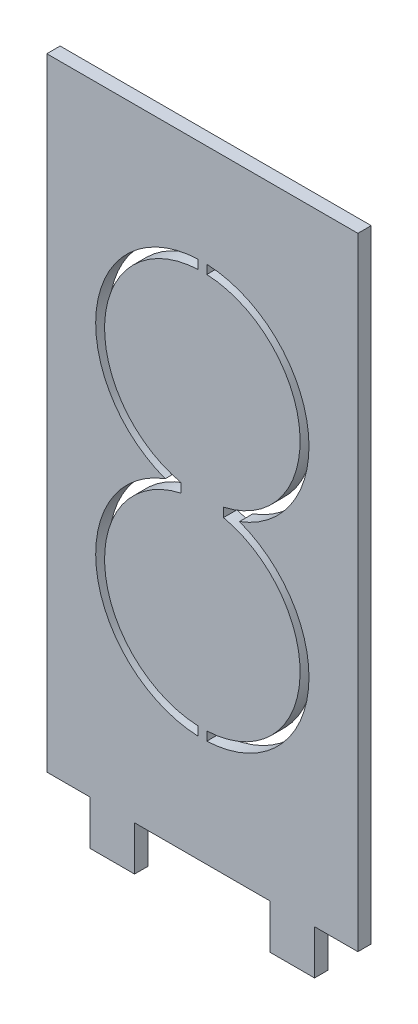
ISO-10303-21;
HEADER;
FILE_DESCRIPTION(('STEP AP214'),'2;1');
FILE_NAME('part.step','',(''),(''),'','','');
FILE_SCHEMA(('AUTOMOTIVE_DESIGN { 1 0 10303 214 1 1 1 1 }'));
ENDSEC;
DATA;
#1=APPLICATION_CONTEXT('core data for automotive mechanical design processes');
#2=APPLICATION_PROTOCOL_DEFINITION('international standard','automotive_design',2000,#1);
#3=PRODUCT_CONTEXT('',#1,'mechanical');
#4=PRODUCT('Part','Part','',(#3));
#5=PRODUCT_RELATED_PRODUCT_CATEGORY('part','',(#4));
#6=PRODUCT_DEFINITION_FORMATION('','',#4);
#7=PRODUCT_DEFINITION_CONTEXT('part definition',#1,'design');
#8=PRODUCT_DEFINITION('design','',#6,#7);
#9=PRODUCT_DEFINITION_SHAPE('','',#8);
#10=(LENGTH_UNIT() NAMED_UNIT(*) SI_UNIT(.MILLI.,.METRE.));
#11=(NAMED_UNIT(*) PLANE_ANGLE_UNIT() SI_UNIT($,.RADIAN.));
#12=(NAMED_UNIT(*) SI_UNIT($,.STERADIAN.) SOLID_ANGLE_UNIT());
#13=UNCERTAINTY_MEASURE_WITH_UNIT(LENGTH_MEASURE(1.E-05),#10,'distance_accuracy_value','');
#14=(GEOMETRIC_REPRESENTATION_CONTEXT(3) GLOBAL_UNCERTAINTY_ASSIGNED_CONTEXT((#13)) GLOBAL_UNIT_ASSIGNED_CONTEXT((#10,
#11,#12)) REPRESENTATION_CONTEXT('',''));
#15=CARTESIAN_POINT('',(0.,0.,0.));
#16=DIRECTION('',(0.,0.,1.));
#17=DIRECTION('',(1.,0.,0.));
#18=AXIS2_PLACEMENT_3D('',#15,#16,#17);
#19=CARTESIAN_POINT('',(18.,68.1857282912457,0.));
#20=DIRECTION('',(1.,0.,0.));
#21=DIRECTION('',(0.,1.,0.));
#22=AXIS2_PLACEMENT_3D('',#19,#20,#21);
#23=PLANE('',#22);
#24=DIRECTION('',(0.,1.,0.));
#25=VECTOR('',#24,1.);
#26=CARTESIAN_POINT('',(18.,68.1857282912457,1.5));
#27=LINE('',#26,#25);
#28=CARTESIAN_POINT('',(18.,17.0113708575995,1.5));
#29=VERTEX_POINT('',#28);
#30=CARTESIAN_POINT('',(18.,18.011369512082,1.5));
#31=VERTEX_POINT('',#30);
#32=EDGE_CURVE('E257',#29,#31,#27,.T.);
#33=ORIENTED_EDGE('',*,*,#32,.F.);
#34=DIRECTION('',(0.,0.,1.));
#35=VECTOR('',#34,1.);
#36=CARTESIAN_POINT('',(18.,17.0113708575995,0.));
#37=LINE('',#36,#35);
#38=CARTESIAN_POINT('',(18.,17.0113708575995,0.));
#39=VERTEX_POINT('',#38);
#40=EDGE_CURVE('E214',#29,#39,#37,.F.);
#41=ORIENTED_EDGE('',*,*,#40,.T.);
#42=DIRECTION('',(0.,1.,0.));
#43=VECTOR('',#42,1.);
#44=CARTESIAN_POINT('',(18.,68.1857282912457,0.));
#45=LINE('',#44,#43);
#46=CARTESIAN_POINT('',(18.,18.011369512082,0.));
#47=VERTEX_POINT('',#46);
#48=EDGE_CURVE('E253',#39,#47,#45,.T.);
#49=ORIENTED_EDGE('',*,*,#48,.T.);
#50=DIRECTION('',(0.,0.,1.));
#51=VECTOR('',#50,1.);
#52=CARTESIAN_POINT('',(18.,18.011369512082,0.));
#53=LINE('',#52,#51);
#54=EDGE_CURVE('E255',#47,#31,#53,.T.);
#55=ORIENTED_EDGE('',*,*,#54,.T.);
#56=EDGE_LOOP('',(#33,#41,#49,#55));
#57=FACE_BOUND('',#56,.T.);
#58=ADVANCED_FACE('F35',(#57),#23,.T.);
#59=CARTESIAN_POINT('',(17.,68.1857282912457,0.));
#60=DIRECTION('',(-1.,0.,0.));
#61=DIRECTION('',(0.,-1.,0.));
#62=AXIS2_PLACEMENT_3D('',#59,#60,#61);
#63=PLANE('',#62);
#64=DIRECTION('',(0.,-1.,0.));
#65=VECTOR('',#64,1.);
#66=CARTESIAN_POINT('',(17.,68.1857282912457,0.));
#67=LINE('',#66,#65);
#68=CARTESIAN_POINT('',(17.,18.011369512082,0.));
#69=VERTEX_POINT('',#68);
#70=CARTESIAN_POINT('',(17.,17.0113708575995,0.));
#71=VERTEX_POINT('',#70);
#72=EDGE_CURVE('E252',#69,#71,#67,.T.);
#73=ORIENTED_EDGE('',*,*,#72,.T.);
#74=DIRECTION('',(0.,0.,1.));
#75=VECTOR('',#74,1.);
#76=CARTESIAN_POINT('',(17.,17.0113708575995,0.));
#77=LINE('',#76,#75);
#78=CARTESIAN_POINT('',(17.,17.0113708575995,1.5));
#79=VERTEX_POINT('',#78);
#80=EDGE_CURVE('E11',#71,#79,#77,.T.);
#81=ORIENTED_EDGE('',*,*,#80,.T.);
#82=DIRECTION('',(0.,-1.,0.));
#83=VECTOR('',#82,1.);
#84=CARTESIAN_POINT('',(17.,68.1857282912457,1.5));
#85=LINE('',#84,#83);
#86=CARTESIAN_POINT('',(17.,18.0113695120821,1.5));
#87=VERTEX_POINT('',#86);
#88=EDGE_CURVE('E248',#87,#79,#85,.T.);
#89=ORIENTED_EDGE('',*,*,#88,.F.);
#90=DIRECTION('',(0.,0.,1.));
#91=VECTOR('',#90,1.);
#92=CARTESIAN_POINT('',(17.,18.011369512082,0.));
#93=LINE('',#92,#91);
#94=EDGE_CURVE('E263',#87,#69,#93,.F.);
#95=ORIENTED_EDGE('',*,*,#94,.T.);
#96=EDGE_LOOP('',(#73,#81,#89,#95));
#97=FACE_BOUND('',#96,.T.);
#98=ADVANCED_FACE('F463',(#97),#63,.T.);
#99=CARTESIAN_POINT('',(17.,63.4895789873627,1.5));
#100=VERTEX_POINT('',#99);
#101=CARTESIAN_POINT('',(17.,62.488630487918,1.5));
#102=VERTEX_POINT('',#101);
#103=EDGE_CURVE('E57',#100,#102,#85,.T.);
#104=ORIENTED_EDGE('',*,*,#103,.F.);
#105=DIRECTION('',(0.,0.,1.));
#106=VECTOR('',#105,1.);
#107=CARTESIAN_POINT('',(17.,63.4895789873627,0.));
#108=LINE('',#107,#106);
#109=CARTESIAN_POINT('',(17.,63.4895789873627,0.));
#110=VERTEX_POINT('',#109);
#111=EDGE_CURVE('E227',#100,#110,#108,.F.);
#112=ORIENTED_EDGE('',*,*,#111,.T.);
#113=CARTESIAN_POINT('',(17.,62.488630487918,0.));
#114=VERTEX_POINT('',#113);
#115=EDGE_CURVE('E249',#110,#114,#67,.T.);
#116=ORIENTED_EDGE('',*,*,#115,.T.);
#117=DIRECTION('',(0.,0.,1.));
#118=VECTOR('',#117,1.);
#119=CARTESIAN_POINT('',(17.,62.488630487918,0.));
#120=LINE('',#119,#118);
#121=EDGE_CURVE('E265',#114,#102,#120,.T.);
#122=ORIENTED_EDGE('',*,*,#121,.T.);
#123=EDGE_LOOP('',(#104,#112,#116,#122));
#124=FACE_BOUND('',#123,.T.);
#125=ADVANCED_FACE('F469',(#124),#63,.T.);
#126=CARTESIAN_POINT('',(18.,62.488630487918,0.));
#127=VERTEX_POINT('',#126);
#128=CARTESIAN_POINT('',(18.,63.4895789873627,0.));
#129=VERTEX_POINT('',#128);
#130=EDGE_CURVE('E251',#127,#129,#45,.T.);
#131=ORIENTED_EDGE('',*,*,#130,.T.);
#132=DIRECTION('',(0.,0.,1.));
#133=VECTOR('',#132,1.);
#134=CARTESIAN_POINT('',(18.,63.4895789873627,0.));
#135=LINE('',#134,#133);
#136=CARTESIAN_POINT('',(18.,63.4895789873627,1.5));
#137=VERTEX_POINT('',#136);
#138=EDGE_CURVE('E43',#129,#137,#135,.T.);
#139=ORIENTED_EDGE('',*,*,#138,.T.);
#140=CARTESIAN_POINT('',(18.,62.488630487918,1.5));
#141=VERTEX_POINT('',#140);
#142=EDGE_CURVE('E233',#141,#137,#27,.T.);
#143=ORIENTED_EDGE('',*,*,#142,.F.);
#144=DIRECTION('',(0.,0.,1.));
#145=VECTOR('',#144,1.);
#146=CARTESIAN_POINT('',(18.,62.488630487918,0.));
#147=LINE('',#146,#145);
#148=EDGE_CURVE('E261',#141,#127,#147,.F.);
#149=ORIENTED_EDGE('',*,*,#148,.T.);
#150=EDGE_LOOP('',(#131,#139,#143,#149));
#151=FACE_BOUND('',#150,.T.);
#152=ADVANCED_FACE('F305',(#151),#23,.T.);
#153=CARTESIAN_POINT('',(17.5,51.5,0.));
#154=DIRECTION('',(0.,0.,1.));
#155=DIRECTION('',(1.,0.,0.));
#156=AXIS2_PLACEMENT_3D('',#153,#154,#155);
#157=CYLINDRICAL_SURFACE('',#156,11.);
#158=ORIENTED_EDGE('',*,*,#121,.F.);
#159=CARTESIAN_POINT('',(17.5,51.5,0.));
#160=DIRECTION('',(0.,0.,1.));
#161=DIRECTION('',(1.,0.,0.));
#162=AXIS2_PLACEMENT_3D('',#159,#160,#161);
#163=CIRCLE('',#162,11.);
#164=CARTESIAN_POINT('',(15.1175085662066,40.7611111111111,0.));
#165=VERTEX_POINT('',#164);
#166=EDGE_CURVE('E275',#114,#165,#163,.T.);
#167=ORIENTED_EDGE('',*,*,#166,.T.);
#168=DIRECTION('',(0.,0.,1.));
#169=VECTOR('',#168,1.);
#170=CARTESIAN_POINT('',(15.1175085662066,40.7611111111111,0.));
#171=LINE('',#170,#169);
#172=CARTESIAN_POINT('',(15.1175085662066,40.7611111111111,1.5));
#173=VERTEX_POINT('',#172);
#174=EDGE_CURVE('E297',#165,#173,#171,.T.);
#175=ORIENTED_EDGE('',*,*,#174,.T.);
#176=CARTESIAN_POINT('',(17.5,51.5,1.5));
#177=DIRECTION('',(0.,0.,1.));
#178=DIRECTION('',(1.,0.,0.));
#179=AXIS2_PLACEMENT_3D('',#176,#177,#178);
#180=CIRCLE('',#179,11.);
#181=EDGE_CURVE('E289',#102,#173,#180,.T.);
#182=ORIENTED_EDGE('',*,*,#181,.F.);
#183=EDGE_LOOP('',(#158,#167,#175,#182));
#184=FACE_BOUND('',#183,.T.);
#185=ADVANCED_FACE('F474',(#184),#157,.T.);
#186=CARTESIAN_POINT('',(17.5,29.,0.));
#187=DIRECTION('',(0.,0.,1.));
#188=DIRECTION('',(1.,0.,0.));
#189=AXIS2_PLACEMENT_3D('',#186,#187,#188);
#190=CYLINDRICAL_SURFACE('',#189,11.);
#191=ORIENTED_EDGE('',*,*,#94,.F.);
#192=CARTESIAN_POINT('',(17.5,29.,1.5));
#193=DIRECTION('',(0.,0.,1.));
#194=DIRECTION('',(-1.,0.,0.));
#195=AXIS2_PLACEMENT_3D('',#192,#193,#194);
#196=CIRCLE('',#195,11.);
#197=CARTESIAN_POINT('',(15.1175085662066,39.7388888888889,1.5));
#198=VERTEX_POINT('',#197);
#199=EDGE_CURVE('E283',#198,#87,#196,.T.);
#200=ORIENTED_EDGE('',*,*,#199,.F.);
#201=DIRECTION('',(0.,0.,1.));
#202=VECTOR('',#201,1.);
#203=CARTESIAN_POINT('',(15.1175085662066,39.7388888888889,0.));
#204=LINE('',#203,#202);
#205=CARTESIAN_POINT('',(15.1175085662066,39.7388888888889,0.));
#206=VERTEX_POINT('',#205);
#207=EDGE_CURVE('E295',#206,#198,#204,.T.);
#208=ORIENTED_EDGE('',*,*,#207,.F.);
#209=CARTESIAN_POINT('',(17.5,29.,0.));
#210=DIRECTION('',(0.,0.,1.));
#211=DIRECTION('',(-1.,0.,0.));
#212=AXIS2_PLACEMENT_3D('',#209,#210,#211);
#213=CIRCLE('',#212,11.);
#214=EDGE_CURVE('E268',#206,#69,#213,.T.);
#215=ORIENTED_EDGE('',*,*,#214,.T.);
#216=EDGE_LOOP('',(#191,#200,#208,#215));
#217=FACE_BOUND('',#216,.T.);
#218=ADVANCED_FACE('F479',(#217),#190,.T.);
#219=CARTESIAN_POINT('',(0.,0.,0.));
#220=DIRECTION('',(0.,0.,-1.));
#221=DIRECTION('',(-1.,0.,0.));
#222=AXIS2_PLACEMENT_3D('',#219,#220,#221);
#223=PLANE('',#222);
#224=CARTESIAN_POINT('',(17.5,29.,0.));
#225=DIRECTION('',(0.,0.,1.));
#226=DIRECTION('',(-1.,0.,0.));
#227=AXIS2_PLACEMENT_3D('',#224,#225,#226);
#228=CIRCLE('',#227,11.9990511589048);
#229=CARTESIAN_POINT('',(13.325540005228,40.2494938759957,0.));
#230=VERTEX_POINT('',#229);
#231=EDGE_CURVE('E242',#230,#71,#228,.T.);
#232=ORIENTED_EDGE('',*,*,#231,.T.);
#233=ORIENTED_EDGE('',*,*,#72,.F.);
#234=ORIENTED_EDGE('',*,*,#214,.F.);
#235=DIRECTION('',(0.,-1.,0.));
#236=VECTOR('',#235,1.);
#237=CARTESIAN_POINT('',(15.1175085662066,40.7611111111111,0.));
#238=LINE('',#237,#236);
#239=EDGE_CURVE('E279',#165,#206,#238,.T.);
#240=ORIENTED_EDGE('',*,*,#239,.F.);
#241=ORIENTED_EDGE('',*,*,#166,.F.);
#242=ORIENTED_EDGE('',*,*,#115,.F.);
#243=CARTESIAN_POINT('',(17.5,51.5,0.));
#244=DIRECTION('',(0.,0.,1.));
#245=DIRECTION('',(1.,0.,0.));
#246=AXIS2_PLACEMENT_3D('',#243,#244,#245);
#247=CIRCLE('',#246,12.0000001789254);
#248=EDGE_CURVE('E241',#110,#230,#247,.T.);
#249=ORIENTED_EDGE('',*,*,#248,.T.);
#250=EDGE_LOOP('',(#232,#233,#234,#240,#241,#242,#249));
#251=FACE_BOUND('',#250,.T.);
#252=ORIENTED_EDGE('',*,*,#48,.F.);
#253=CARTESIAN_POINT('',(21.6744599947719,40.2494938759957,0.));
#254=VERTEX_POINT('',#253);
#255=EDGE_CURVE('E245',#39,#254,#228,.T.);
#256=ORIENTED_EDGE('',*,*,#255,.T.);
#257=EDGE_CURVE('E226',#254,#129,#247,.T.);
#258=ORIENTED_EDGE('',*,*,#257,.T.);
#259=ORIENTED_EDGE('',*,*,#130,.F.);
#260=CARTESIAN_POINT('',(19.8824914337934,40.7611111111111,0.));
#261=VERTEX_POINT('',#260);
#262=EDGE_CURVE('E276',#261,#127,#163,.T.);
#263=ORIENTED_EDGE('',*,*,#262,.F.);
#264=DIRECTION('',(0.,1.,0.));
#265=VECTOR('',#264,1.);
#266=CARTESIAN_POINT('',(19.8824914337934,40.7611111111111,0.));
#267=LINE('',#266,#265);
#268=CARTESIAN_POINT('',(19.8824914337934,39.7388888888889,0.));
#269=VERTEX_POINT('',#268);
#270=EDGE_CURVE('E271',#269,#261,#267,.T.);
#271=ORIENTED_EDGE('',*,*,#270,.F.);
#272=EDGE_CURVE('E272',#47,#269,#213,.T.);
#273=ORIENTED_EDGE('',*,*,#272,.F.);
#274=EDGE_LOOP('',(#252,#256,#258,#259,#263,#271,#273));
#275=FACE_BOUND('',#274,.T.);
#276=DIRECTION('',(0.,-1.,0.));
#277=VECTOR('',#276,1.);
#278=CARTESIAN_POINT('',(4.875,0.,0.));
#279=LINE('',#278,#277);
#280=CARTESIAN_POINT('',(4.875,5.,0.));
#281=VERTEX_POINT('',#280);
#282=CARTESIAN_POINT('',(4.875,0.,0.));
#283=VERTEX_POINT('',#282);
#284=EDGE_CURVE('E357',#281,#283,#279,.T.);
#285=ORIENTED_EDGE('',*,*,#284,.F.);
#286=DIRECTION('',(1.,0.,0.));
#287=VECTOR('',#286,1.);
#288=CARTESIAN_POINT('',(0.,5.,0.));
#289=LINE('',#288,#287);
#290=CARTESIAN_POINT('',(0.,5.,0.));
#291=VERTEX_POINT('',#290);
#292=EDGE_CURVE('E349',#291,#281,#289,.T.);
#293=ORIENTED_EDGE('',*,*,#292,.F.);
#294=DIRECTION('',(0.,-1.,0.));
#295=VECTOR('',#294,1.);
#296=CARTESIAN_POINT('',(0.,0.,0.));
#297=LINE('',#296,#295);
#298=CARTESIAN_POINT('',(0.,75.,0.));
#299=VERTEX_POINT('',#298);
#300=EDGE_CURVE('E328',#299,#291,#297,.T.);
#301=ORIENTED_EDGE('',*,*,#300,.F.);
#302=DIRECTION('',(-1.,0.,0.));
#303=VECTOR('',#302,1.);
#304=CARTESIAN_POINT('',(0.,75.,0.));
#305=LINE('',#304,#303);
#306=CARTESIAN_POINT('',(35.,75.,0.));
#307=VERTEX_POINT('',#306);
#308=EDGE_CURVE('E392',#307,#299,#305,.T.);
#309=ORIENTED_EDGE('',*,*,#308,.F.);
#310=DIRECTION('',(0.,1.,0.));
#311=VECTOR('',#310,1.);
#312=CARTESIAN_POINT('',(35.,0.,0.));
#313=LINE('',#312,#311);
#314=CARTESIAN_POINT('',(35.,5.,0.));
#315=VERTEX_POINT('',#314);
#316=EDGE_CURVE('E364',#315,#307,#313,.T.);
#317=ORIENTED_EDGE('',*,*,#316,.F.);
#318=DIRECTION('',(1.,0.,0.));
#319=VECTOR('',#318,1.);
#320=CARTESIAN_POINT('',(0.,5.,0.));
#321=LINE('',#320,#319);
#322=CARTESIAN_POINT('',(30.125,5.,0.));
#323=VERTEX_POINT('',#322);
#324=EDGE_CURVE('E369',#323,#315,#321,.T.);
#325=ORIENTED_EDGE('',*,*,#324,.F.);
#326=DIRECTION('',(0.,1.,0.));
#327=VECTOR('',#326,1.);
#328=CARTESIAN_POINT('',(30.125,0.,0.));
#329=LINE('',#328,#327);
#330=CARTESIAN_POINT('',(30.125,0.,0.));
#331=VERTEX_POINT('',#330);
#332=EDGE_CURVE('E345',#331,#323,#329,.T.);
#333=ORIENTED_EDGE('',*,*,#332,.F.);
#334=DIRECTION('',(1.,0.,0.));
#335=VECTOR('',#334,1.);
#336=CARTESIAN_POINT('',(0.,0.,0.));
#337=LINE('',#336,#335);
#338=CARTESIAN_POINT('',(25.125,0.,0.));
#339=VERTEX_POINT('',#338);
#340=EDGE_CURVE('E365',#339,#331,#337,.T.);
#341=ORIENTED_EDGE('',*,*,#340,.F.);
#342=DIRECTION('',(0.,-1.,0.));
#343=VECTOR('',#342,1.);
#344=CARTESIAN_POINT('',(25.125,0.,0.));
#345=LINE('',#344,#343);
#346=CARTESIAN_POINT('',(25.125,5.,0.));
#347=VERTEX_POINT('',#346);
#348=EDGE_CURVE('E333',#347,#339,#345,.T.);
#349=ORIENTED_EDGE('',*,*,#348,.F.);
#350=DIRECTION('',(1.,0.,0.));
#351=VECTOR('',#350,1.);
#352=CARTESIAN_POINT('',(0.,5.,0.));
#353=LINE('',#352,#351);
#354=CARTESIAN_POINT('',(9.875,5.,0.));
#355=VERTEX_POINT('',#354);
#356=EDGE_CURVE('E337',#355,#347,#353,.T.);
#357=ORIENTED_EDGE('',*,*,#356,.F.);
#358=DIRECTION('',(0.,1.,0.));
#359=VECTOR('',#358,1.);
#360=CARTESIAN_POINT('',(9.875,0.,0.));
#361=LINE('',#360,#359);
#362=CARTESIAN_POINT('',(9.875,0.,0.));
#363=VERTEX_POINT('',#362);
#364=EDGE_CURVE('E240',#363,#355,#361,.T.);
#365=ORIENTED_EDGE('',*,*,#364,.F.);
#366=EDGE_CURVE('E329',#283,#363,#337,.T.);
#367=ORIENTED_EDGE('',*,*,#366,.F.);
#368=EDGE_LOOP('',(#285,#293,#301,#309,#317,#325,#333,#341,#349,#357,#365,#367));
#369=FACE_BOUND('',#368,.T.);
#370=ADVANCED_FACE('F37',(#251,#275,#369),#223,.T.);
#371=CARTESIAN_POINT('',(19.8824914337934,40.7611111111111,0.));
#372=DIRECTION('',(1.,0.,0.));
#373=DIRECTION('',(0.,0.,-1.));
#374=AXIS2_PLACEMENT_3D('',#371,#372,#373);
#375=PLANE('',#374);
#376=DIRECTION('',(0.,1.,0.));
#377=VECTOR('',#376,1.);
#378=CARTESIAN_POINT('',(19.8824914337934,40.7611111111111,1.5));
#379=LINE('',#378,#377);
#380=CARTESIAN_POINT('',(19.8824914337934,39.7388888888889,1.5));
#381=VERTEX_POINT('',#380);
#382=CARTESIAN_POINT('',(19.8824914337934,40.7611111111111,1.5));
#383=VERTEX_POINT('',#382);
#384=EDGE_CURVE('E286',#381,#383,#379,.T.);
#385=ORIENTED_EDGE('',*,*,#384,.F.);
#386=DIRECTION('',(0.,0.,1.));
#387=VECTOR('',#386,1.);
#388=CARTESIAN_POINT('',(19.8824914337934,39.7388888888889,0.));
#389=LINE('',#388,#387);
#390=EDGE_CURVE('E282',#269,#381,#389,.T.);
#391=ORIENTED_EDGE('',*,*,#390,.F.);
#392=ORIENTED_EDGE('',*,*,#270,.T.);
#393=DIRECTION('',(0.,0.,1.));
#394=VECTOR('',#393,1.);
#395=CARTESIAN_POINT('',(19.8824914337934,40.7611111111111,0.));
#396=LINE('',#395,#394);
#397=EDGE_CURVE('E300',#261,#383,#396,.T.);
#398=ORIENTED_EDGE('',*,*,#397,.T.);
#399=EDGE_LOOP('',(#385,#391,#392,#398));
#400=FACE_BOUND('',#399,.T.);
#401=ADVANCED_FACE('F492',(#400),#375,.T.);
#402=ORIENTED_EDGE('',*,*,#148,.F.);
#403=EDGE_CURVE('E290',#383,#141,#180,.T.);
#404=ORIENTED_EDGE('',*,*,#403,.F.);
#405=ORIENTED_EDGE('',*,*,#397,.F.);
#406=ORIENTED_EDGE('',*,*,#262,.T.);
#407=EDGE_LOOP('',(#402,#404,#405,#406));
#408=FACE_BOUND('',#407,.T.);
#409=ADVANCED_FACE('F482',(#408),#157,.T.);
#410=CARTESIAN_POINT('',(15.1175085662066,40.7611111111111,0.));
#411=DIRECTION('',(-1.,0.,0.));
#412=DIRECTION('',(0.,0.,1.));
#413=AXIS2_PLACEMENT_3D('',#410,#411,#412);
#414=PLANE('',#413);
#415=DIRECTION('',(0.,-1.,0.));
#416=VECTOR('',#415,1.);
#417=CARTESIAN_POINT('',(15.1175085662066,40.7611111111111,1.5));
#418=LINE('',#417,#416);
#419=EDGE_CURVE('E292',#173,#198,#418,.T.);
#420=ORIENTED_EDGE('',*,*,#419,.F.);
#421=ORIENTED_EDGE('',*,*,#174,.F.);
#422=ORIENTED_EDGE('',*,*,#239,.T.);
#423=ORIENTED_EDGE('',*,*,#207,.T.);
#424=EDGE_LOOP('',(#420,#421,#422,#423));
#425=FACE_BOUND('',#424,.T.);
#426=ADVANCED_FACE('F486',(#425),#414,.T.);
#427=ORIENTED_EDGE('',*,*,#54,.F.);
#428=ORIENTED_EDGE('',*,*,#272,.T.);
#429=ORIENTED_EDGE('',*,*,#390,.T.);
#430=EDGE_CURVE('E267',#31,#381,#196,.T.);
#431=ORIENTED_EDGE('',*,*,#430,.F.);
#432=EDGE_LOOP('',(#427,#428,#429,#431));
#433=FACE_BOUND('',#432,.T.);
#434=ADVANCED_FACE('F488',(#433),#190,.T.);
#435=CARTESIAN_POINT('',(0.,0.,1.5));
#436=DIRECTION('',(0.,0.,-1.));
#437=DIRECTION('',(-1.,0.,0.));
#438=AXIS2_PLACEMENT_3D('',#435,#436,#437);
#439=PLANE('',#438);
#440=ORIENTED_EDGE('',*,*,#88,.T.);
#441=CARTESIAN_POINT('',(17.5,29.,1.5));
#442=DIRECTION('',(0.,0.,1.));
#443=DIRECTION('',(-1.,0.,0.));
#444=AXIS2_PLACEMENT_3D('',#441,#442,#443);
#445=CIRCLE('',#444,11.9990511589048);
#446=CARTESIAN_POINT('',(13.325540005228,40.2494938759957,1.5));
#447=VERTEX_POINT('',#446);
#448=EDGE_CURVE('E50',#447,#79,#445,.T.);
#449=ORIENTED_EDGE('',*,*,#448,.F.);
#450=CARTESIAN_POINT('',(17.5,51.5,1.5));
#451=DIRECTION('',(0.,0.,1.));
#452=DIRECTION('',(1.,0.,0.));
#453=AXIS2_PLACEMENT_3D('',#450,#451,#452);
#454=CIRCLE('',#453,12.0000001789254);
#455=EDGE_CURVE('E234',#100,#447,#454,.T.);
#456=ORIENTED_EDGE('',*,*,#455,.F.);
#457=ORIENTED_EDGE('',*,*,#103,.T.);
#458=ORIENTED_EDGE('',*,*,#181,.T.);
#459=ORIENTED_EDGE('',*,*,#419,.T.);
#460=ORIENTED_EDGE('',*,*,#199,.T.);
#461=EDGE_LOOP('',(#440,#449,#456,#457,#458,#459,#460));
#462=FACE_BOUND('',#461,.T.);
#463=CARTESIAN_POINT('',(21.6744599947719,40.2494938759957,1.5));
#464=VERTEX_POINT('',#463);
#465=EDGE_CURVE('E208',#29,#464,#445,.T.);
#466=ORIENTED_EDGE('',*,*,#465,.F.);
#467=ORIENTED_EDGE('',*,*,#32,.T.);
#468=ORIENTED_EDGE('',*,*,#430,.T.);
#469=ORIENTED_EDGE('',*,*,#384,.T.);
#470=ORIENTED_EDGE('',*,*,#403,.T.);
#471=ORIENTED_EDGE('',*,*,#142,.T.);
#472=EDGE_CURVE('E224',#464,#137,#454,.T.);
#473=ORIENTED_EDGE('',*,*,#472,.F.);
#474=EDGE_LOOP('',(#466,#467,#468,#469,#470,#471,#473));
#475=FACE_BOUND('',#474,.T.);
#476=DIRECTION('',(-1.,0.,0.));
#477=VECTOR('',#476,1.);
#478=CARTESIAN_POINT('',(4.875,5.,1.5));
#479=LINE('',#478,#477);
#480=CARTESIAN_POINT('',(4.875,5.,1.5));
#481=VERTEX_POINT('',#480);
#482=CARTESIAN_POINT('',(0.,5.,1.5));
#483=VERTEX_POINT('',#482);
#484=EDGE_CURVE('E218',#481,#483,#479,.T.);
#485=ORIENTED_EDGE('',*,*,#484,.F.);
#486=DIRECTION('',(0.,1.,0.));
#487=VECTOR('',#486,1.);
#488=CARTESIAN_POINT('',(4.875,5.,1.5));
#489=LINE('',#488,#487);
#490=CARTESIAN_POINT('',(4.875,0.,1.5));
#491=VERTEX_POINT('',#490);
#492=EDGE_CURVE('E356',#491,#481,#489,.T.);
#493=ORIENTED_EDGE('',*,*,#492,.F.);
#494=DIRECTION('',(1.,0.,0.));
#495=VECTOR('',#494,1.);
#496=CARTESIAN_POINT('',(0.,0.,1.5));
#497=LINE('',#496,#495);
#498=CARTESIAN_POINT('',(9.875,0.,1.5));
#499=VERTEX_POINT('',#498);
#500=EDGE_CURVE('E391',#491,#499,#497,.T.);
#501=ORIENTED_EDGE('',*,*,#500,.T.);
#502=DIRECTION('',(0.,-1.,0.));
#503=VECTOR('',#502,1.);
#504=CARTESIAN_POINT('',(9.875,0.,1.5));
#505=LINE('',#504,#503);
#506=CARTESIAN_POINT('',(9.875,5.,1.5));
#507=VERTEX_POINT('',#506);
#508=EDGE_CURVE('E340',#507,#499,#505,.T.);
#509=ORIENTED_EDGE('',*,*,#508,.F.);
#510=DIRECTION('',(-1.,0.,0.));
#511=VECTOR('',#510,1.);
#512=CARTESIAN_POINT('',(9.875,5.,1.5));
#513=LINE('',#512,#511);
#514=CARTESIAN_POINT('',(25.125,5.,1.5));
#515=VERTEX_POINT('',#514);
#516=EDGE_CURVE('E336',#515,#507,#513,.T.);
#517=ORIENTED_EDGE('',*,*,#516,.F.);
#518=DIRECTION('',(0.,1.,0.));
#519=VECTOR('',#518,1.);
#520=CARTESIAN_POINT('',(25.125,0.,1.5));
#521=LINE('',#520,#519);
#522=CARTESIAN_POINT('',(25.125,0.,1.5));
#523=VERTEX_POINT('',#522);
#524=EDGE_CURVE('E332',#523,#515,#521,.T.);
#525=ORIENTED_EDGE('',*,*,#524,.F.);
#526=CARTESIAN_POINT('',(30.125,0.,1.5));
#527=VERTEX_POINT('',#526);
#528=EDGE_CURVE('E323',#523,#527,#497,.T.);
#529=ORIENTED_EDGE('',*,*,#528,.T.);
#530=DIRECTION('',(0.,-1.,0.));
#531=VECTOR('',#530,1.);
#532=CARTESIAN_POINT('',(30.125,5.,1.5));
#533=LINE('',#532,#531);
#534=CARTESIAN_POINT('',(30.125,5.,1.5));
#535=VERTEX_POINT('',#534);
#536=EDGE_CURVE('E372',#535,#527,#533,.T.);
#537=ORIENTED_EDGE('',*,*,#536,.F.);
#538=DIRECTION('',(-1.,0.,0.));
#539=VECTOR('',#538,1.);
#540=CARTESIAN_POINT('',(30.125,5.,1.5));
#541=LINE('',#540,#539);
#542=CARTESIAN_POINT('',(35.,5.,1.5));
#543=VERTEX_POINT('',#542);
#544=EDGE_CURVE('E368',#543,#535,#541,.T.);
#545=ORIENTED_EDGE('',*,*,#544,.F.);
#546=DIRECTION('',(0.,1.,0.));
#547=VECTOR('',#546,1.);
#548=CARTESIAN_POINT('',(35.,0.,1.5));
#549=LINE('',#548,#547);
#550=CARTESIAN_POINT('',(35.,75.,1.5));
#551=VERTEX_POINT('',#550);
#552=EDGE_CURVE('E319',#543,#551,#549,.T.);
#553=ORIENTED_EDGE('',*,*,#552,.T.);
#554=DIRECTION('',(-1.,0.,0.));
#555=VECTOR('',#554,1.);
#556=CARTESIAN_POINT('',(0.,75.,1.5));
#557=LINE('',#556,#555);
#558=CARTESIAN_POINT('',(0.,75.,1.5));
#559=VERTEX_POINT('',#558);
#560=EDGE_CURVE('E315',#551,#559,#557,.T.);
#561=ORIENTED_EDGE('',*,*,#560,.T.);
#562=DIRECTION('',(0.,-1.,0.));
#563=VECTOR('',#562,1.);
#564=CARTESIAN_POINT('',(0.,0.,1.5));
#565=LINE('',#564,#563);
#566=EDGE_CURVE('E313',#559,#483,#565,.T.);
#567=ORIENTED_EDGE('',*,*,#566,.T.);
#568=EDGE_LOOP('',(#485,#493,#501,#509,#517,#525,#529,#537,#545,#553,#561,#567));
#569=FACE_BOUND('',#568,.T.);
#570=ADVANCED_FACE('F230',(#462,#475,#569),#439,.F.);
#571=CARTESIAN_POINT('',(17.5,29.,0.));
#572=DIRECTION('',(0.,0.,1.));
#573=DIRECTION('',(1.,0.,0.));
#574=AXIS2_PLACEMENT_3D('',#571,#572,#573);
#575=CYLINDRICAL_SURFACE('',#574,11.9990511589048);
#576=ORIENTED_EDGE('',*,*,#40,.F.);
#577=ORIENTED_EDGE('',*,*,#465,.T.);
#578=DIRECTION('',(0.,0.,1.));
#579=VECTOR('',#578,1.);
#580=CARTESIAN_POINT('',(21.6744599947719,40.2494938759957,0.));
#581=LINE('',#580,#579);
#582=EDGE_CURVE('E211',#254,#464,#581,.T.);
#583=ORIENTED_EDGE('',*,*,#582,.F.);
#584=ORIENTED_EDGE('',*,*,#255,.F.);
#585=EDGE_LOOP('',(#576,#577,#583,#584));
#586=FACE_BOUND('',#585,.T.);
#587=ADVANCED_FACE('F210',(#586),#575,.F.);
#588=CARTESIAN_POINT('',(17.5,51.5,0.));
#589=DIRECTION('',(0.,0.,1.));
#590=DIRECTION('',(1.,0.,0.));
#591=AXIS2_PLACEMENT_3D('',#588,#589,#590);
#592=CYLINDRICAL_SURFACE('',#591,12.0000001789254);
#593=ORIENTED_EDGE('',*,*,#111,.F.);
#594=ORIENTED_EDGE('',*,*,#455,.T.);
#595=DIRECTION('',(0.,0.,1.));
#596=VECTOR('',#595,1.);
#597=CARTESIAN_POINT('',(13.325540005228,40.2494938759957,0.));
#598=LINE('',#597,#596);
#599=EDGE_CURVE('E236',#230,#447,#598,.T.);
#600=ORIENTED_EDGE('',*,*,#599,.F.);
#601=ORIENTED_EDGE('',*,*,#248,.F.);
#602=EDGE_LOOP('',(#593,#594,#600,#601));
#603=FACE_BOUND('',#602,.T.);
#604=ADVANCED_FACE('F504',(#603),#592,.F.);
#605=CARTESIAN_POINT('',(0.,0.,1.5));
#606=DIRECTION('',(0.,1.,0.));
#607=DIRECTION('',(0.,0.,1.));
#608=AXIS2_PLACEMENT_3D('',#605,#606,#607);
#609=PLANE('',#608);
#610=ORIENTED_EDGE('',*,*,#500,.F.);
#611=DIRECTION('',(0.,0.,1.));
#612=VECTOR('',#611,1.);
#613=CARTESIAN_POINT('',(4.875,0.,-18.5));
#614=LINE('',#613,#612);
#615=EDGE_CURVE('E354',#283,#491,#614,.T.);
#616=ORIENTED_EDGE('',*,*,#615,.F.);
#617=ORIENTED_EDGE('',*,*,#366,.T.);
#618=DIRECTION('',(0.,0.,1.));
#619=VECTOR('',#618,1.);
#620=CARTESIAN_POINT('',(9.875,0.,-18.5));
#621=LINE('',#620,#619);
#622=EDGE_CURVE('E325',#363,#499,#621,.T.);
#623=ORIENTED_EDGE('',*,*,#622,.T.);
#624=EDGE_LOOP('',(#610,#616,#617,#623));
#625=FACE_BOUND('',#624,.T.);
#626=ADVANCED_FACE('F413',(#625),#609,.F.);
#627=CARTESIAN_POINT('',(0.,0.,1.5));
#628=DIRECTION('',(1.,0.,0.));
#629=DIRECTION('',(0.,1.,0.));
#630=AXIS2_PLACEMENT_3D('',#627,#628,#629);
#631=PLANE('',#630);
#632=ORIENTED_EDGE('',*,*,#300,.T.);
#633=DIRECTION('',(0.,0.,1.));
#634=VECTOR('',#633,1.);
#635=CARTESIAN_POINT('',(0.,5.,-18.5));
#636=LINE('',#635,#634);
#637=EDGE_CURVE('E350',#291,#483,#636,.T.);
#638=ORIENTED_EDGE('',*,*,#637,.T.);
#639=ORIENTED_EDGE('',*,*,#566,.F.);
#640=DIRECTION('',(0.,0.,-1.));
#641=VECTOR('',#640,1.);
#642=CARTESIAN_POINT('',(0.,75.,1.5));
#643=LINE('',#642,#641);
#644=EDGE_CURVE('E353',#559,#299,#643,.T.);
#645=ORIENTED_EDGE('',*,*,#644,.T.);
#646=EDGE_LOOP('',(#632,#638,#639,#645));
#647=FACE_BOUND('',#646,.T.);
#648=ADVANCED_FACE('F443',(#647),#631,.F.);
#649=ORIENTED_EDGE('',*,*,#340,.T.);
#650=DIRECTION('',(0.,0.,1.));
#651=VECTOR('',#650,1.);
#652=CARTESIAN_POINT('',(30.125,0.,-18.5));
#653=LINE('',#652,#651);
#654=EDGE_CURVE('E361',#331,#527,#653,.T.);
#655=ORIENTED_EDGE('',*,*,#654,.T.);
#656=ORIENTED_EDGE('',*,*,#528,.F.);
#657=DIRECTION('',(0.,0.,1.));
#658=VECTOR('',#657,1.);
#659=CARTESIAN_POINT('',(25.125,0.,-18.5));
#660=LINE('',#659,#658);
#661=EDGE_CURVE('E330',#339,#523,#660,.T.);
#662=ORIENTED_EDGE('',*,*,#661,.F.);
#663=EDGE_LOOP('',(#649,#655,#656,#662));
#664=FACE_BOUND('',#663,.T.);
#665=ADVANCED_FACE('F429',(#664),#609,.F.);
#666=CARTESIAN_POINT('',(35.,0.,1.5));
#667=DIRECTION('',(-1.,0.,0.));
#668=DIRECTION('',(0.,-1.,0.));
#669=AXIS2_PLACEMENT_3D('',#666,#667,#668);
#670=PLANE('',#669);
#671=ORIENTED_EDGE('',*,*,#552,.F.);
#672=DIRECTION('',(0.,0.,1.));
#673=VECTOR('',#672,1.);
#674=CARTESIAN_POINT('',(35.,5.,-18.5));
#675=LINE('',#674,#673);
#676=EDGE_CURVE('E366',#315,#543,#675,.T.);
#677=ORIENTED_EDGE('',*,*,#676,.F.);
#678=ORIENTED_EDGE('',*,*,#316,.T.);
#679=DIRECTION('',(0.,0.,-1.));
#680=VECTOR('',#679,1.);
#681=CARTESIAN_POINT('',(35.,75.,1.5));
#682=LINE('',#681,#680);
#683=EDGE_CURVE('E388',#551,#307,#682,.T.);
#684=ORIENTED_EDGE('',*,*,#683,.F.);
#685=EDGE_LOOP('',(#671,#677,#678,#684));
#686=FACE_BOUND('',#685,.T.);
#687=ADVANCED_FACE('F437',(#686),#670,.F.);
#688=CARTESIAN_POINT('',(0.,75.,1.5));
#689=DIRECTION('',(0.,-1.,0.));
#690=DIRECTION('',(0.,0.,-1.));
#691=AXIS2_PLACEMENT_3D('',#688,#689,#690);
#692=PLANE('',#691);
#693=ORIENTED_EDGE('',*,*,#308,.T.);
#694=ORIENTED_EDGE('',*,*,#644,.F.);
#695=ORIENTED_EDGE('',*,*,#560,.F.);
#696=ORIENTED_EDGE('',*,*,#683,.T.);
#697=EDGE_LOOP('',(#693,#694,#695,#696));
#698=FACE_BOUND('',#697,.T.);
#699=ADVANCED_FACE('F440',(#698),#692,.F.);
#700=CARTESIAN_POINT('',(9.875,0.,-18.5));
#701=DIRECTION('',(-1.,0.,0.));
#702=DIRECTION('',(0.,-1.,0.));
#703=AXIS2_PLACEMENT_3D('',#700,#701,#702);
#704=PLANE('',#703);
#705=ORIENTED_EDGE('',*,*,#364,.T.);
#706=DIRECTION('',(0.,0.,1.));
#707=VECTOR('',#706,1.);
#708=CARTESIAN_POINT('',(9.875,5.,-18.5));
#709=LINE('',#708,#707);
#710=EDGE_CURVE('E338',#355,#507,#709,.T.);
#711=ORIENTED_EDGE('',*,*,#710,.T.);
#712=ORIENTED_EDGE('',*,*,#508,.T.);
#713=ORIENTED_EDGE('',*,*,#622,.F.);
#714=EDGE_LOOP('',(#705,#711,#712,#713));
#715=FACE_BOUND('',#714,.T.);
#716=ADVANCED_FACE('F418',(#715),#704,.F.);
#717=CARTESIAN_POINT('',(9.875,5.,-18.5));
#718=DIRECTION('',(0.,1.,0.));
#719=DIRECTION('',(0.,0.,1.));
#720=AXIS2_PLACEMENT_3D('',#717,#718,#719);
#721=PLANE('',#720);
#722=ORIENTED_EDGE('',*,*,#356,.T.);
#723=DIRECTION('',(0.,0.,1.));
#724=VECTOR('',#723,1.);
#725=CARTESIAN_POINT('',(25.125,5.,-18.5));
#726=LINE('',#725,#724);
#727=EDGE_CURVE('E334',#347,#515,#726,.T.);
#728=ORIENTED_EDGE('',*,*,#727,.T.);
#729=ORIENTED_EDGE('',*,*,#516,.T.);
#730=ORIENTED_EDGE('',*,*,#710,.F.);
#731=EDGE_LOOP('',(#722,#728,#729,#730));
#732=FACE_BOUND('',#731,.T.);
#733=ADVANCED_FACE('F425',(#732),#721,.F.);
#734=CARTESIAN_POINT('',(25.125,0.,-18.5));
#735=DIRECTION('',(1.,0.,0.));
#736=DIRECTION('',(0.,0.,-1.));
#737=AXIS2_PLACEMENT_3D('',#734,#735,#736);
#738=PLANE('',#737);
#739=ORIENTED_EDGE('',*,*,#348,.T.);
#740=ORIENTED_EDGE('',*,*,#661,.T.);
#741=ORIENTED_EDGE('',*,*,#524,.T.);
#742=ORIENTED_EDGE('',*,*,#727,.F.);
#743=EDGE_LOOP('',(#739,#740,#741,#742));
#744=FACE_BOUND('',#743,.T.);
#745=ADVANCED_FACE('F539',(#744),#738,.F.);
#746=CARTESIAN_POINT('',(30.125,5.,-18.5));
#747=DIRECTION('',(-1.,0.,0.));
#748=DIRECTION('',(0.,0.,1.));
#749=AXIS2_PLACEMENT_3D('',#746,#747,#748);
#750=PLANE('',#749);
#751=ORIENTED_EDGE('',*,*,#332,.T.);
#752=DIRECTION('',(0.,0.,1.));
#753=VECTOR('',#752,1.);
#754=CARTESIAN_POINT('',(30.125,5.,-18.5));
#755=LINE('',#754,#753);
#756=EDGE_CURVE('E370',#323,#535,#755,.T.);
#757=ORIENTED_EDGE('',*,*,#756,.T.);
#758=ORIENTED_EDGE('',*,*,#536,.T.);
#759=ORIENTED_EDGE('',*,*,#654,.F.);
#760=EDGE_LOOP('',(#751,#757,#758,#759));
#761=FACE_BOUND('',#760,.T.);
#762=ADVANCED_FACE('F432',(#761),#750,.F.);
#763=CARTESIAN_POINT('',(30.125,5.,-18.5));
#764=DIRECTION('',(0.,1.,0.));
#765=DIRECTION('',(0.,0.,1.));
#766=AXIS2_PLACEMENT_3D('',#763,#764,#765);
#767=PLANE('',#766);
#768=ORIENTED_EDGE('',*,*,#324,.T.);
#769=ORIENTED_EDGE('',*,*,#676,.T.);
#770=ORIENTED_EDGE('',*,*,#544,.T.);
#771=ORIENTED_EDGE('',*,*,#756,.F.);
#772=EDGE_LOOP('',(#768,#769,#770,#771));
#773=FACE_BOUND('',#772,.T.);
#774=ADVANCED_FACE('F452',(#773),#767,.F.);
#775=CARTESIAN_POINT('',(4.875,5.,-18.5));
#776=DIRECTION('',(1.,0.,0.));
#777=DIRECTION('',(0.,1.,0.));
#778=AXIS2_PLACEMENT_3D('',#775,#776,#777);
#779=PLANE('',#778);
#780=ORIENTED_EDGE('',*,*,#284,.T.);
#781=ORIENTED_EDGE('',*,*,#615,.T.);
#782=ORIENTED_EDGE('',*,*,#492,.T.);
#783=DIRECTION('',(0.,0.,1.));
#784=VECTOR('',#783,1.);
#785=CARTESIAN_POINT('',(4.875,5.,-18.5));
#786=LINE('',#785,#784);
#787=EDGE_CURVE('E347',#281,#481,#786,.T.);
#788=ORIENTED_EDGE('',*,*,#787,.F.);
#789=EDGE_LOOP('',(#780,#781,#782,#788));
#790=FACE_BOUND('',#789,.T.);
#791=ADVANCED_FACE('F450',(#790),#779,.F.);
#792=CARTESIAN_POINT('',(4.875,5.,-18.5));
#793=DIRECTION('',(0.,1.,0.));
#794=DIRECTION('',(-1.,0.,0.));
#795=AXIS2_PLACEMENT_3D('',#792,#793,#794);
#796=PLANE('',#795);
#797=ORIENTED_EDGE('',*,*,#292,.T.);
#798=ORIENTED_EDGE('',*,*,#787,.T.);
#799=ORIENTED_EDGE('',*,*,#484,.T.);
#800=ORIENTED_EDGE('',*,*,#637,.F.);
#801=EDGE_LOOP('',(#797,#798,#799,#800));
#802=FACE_BOUND('',#801,.T.);
#803=ADVANCED_FACE('F446',(#802),#796,.F.);
#804=ORIENTED_EDGE('',*,*,#80,.F.);
#805=ORIENTED_EDGE('',*,*,#231,.F.);
#806=ORIENTED_EDGE('',*,*,#599,.T.);
#807=ORIENTED_EDGE('',*,*,#448,.T.);
#808=EDGE_LOOP('',(#804,#805,#806,#807));
#809=FACE_BOUND('',#808,.T.);
#810=ADVANCED_FACE('F458',(#809),#575,.F.);
#811=ORIENTED_EDGE('',*,*,#138,.F.);
#812=ORIENTED_EDGE('',*,*,#257,.F.);
#813=ORIENTED_EDGE('',*,*,#582,.T.);
#814=ORIENTED_EDGE('',*,*,#472,.T.);
#815=EDGE_LOOP('',(#811,#812,#813,#814));
#816=FACE_BOUND('',#815,.T.);
#817=ADVANCED_FACE('F223',(#816),#592,.F.);
#818=CLOSED_SHELL('',(#58,#98,#125,#152,#185,#218,#370,#401,#409,#426,#434,#570,#587,#604,#626,
#648,#665,#687,#699,#716,#733,#745,#762,#774,#791,#803,#810,#817));
#819=MANIFOLD_SOLID_BREP('B2',#818);
#820=ADVANCED_BREP_SHAPE_REPRESENTATION('',(#18,#819),#14);
#821=SHAPE_DEFINITION_REPRESENTATION(#9,#820);
ENDSEC;
END-ISO-10303-21;
